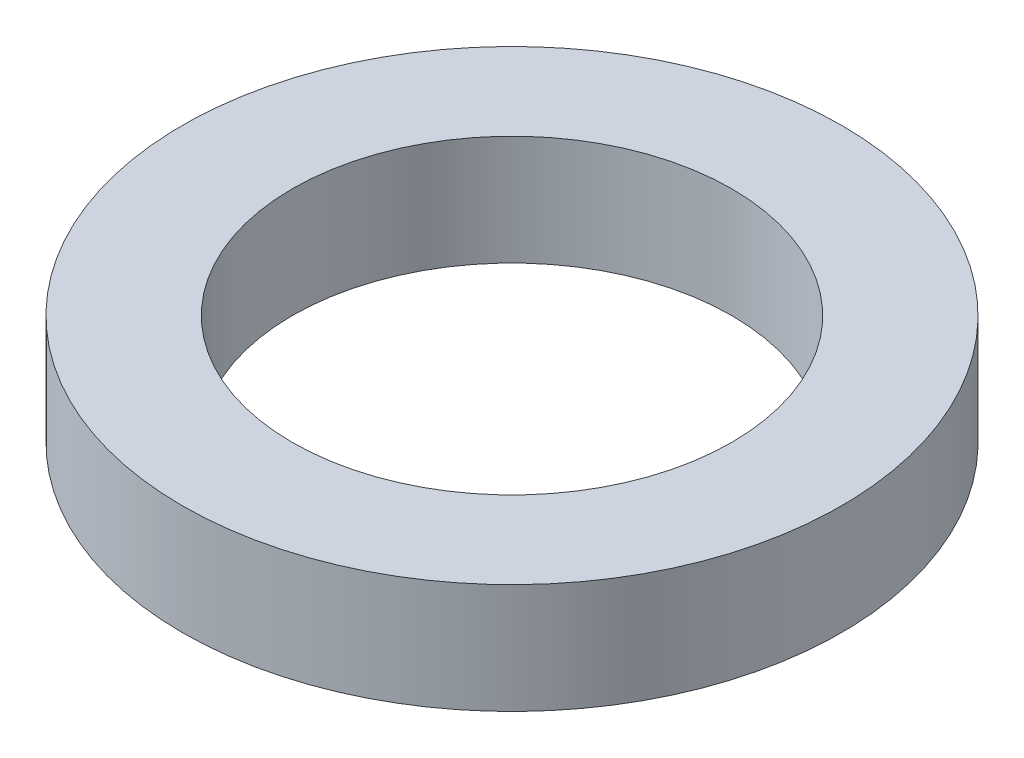
ISO-10303-21;
HEADER;
FILE_DESCRIPTION(('STEP AP214'),'2;1');
FILE_NAME('part.step','',(''),(''),'','','');
FILE_SCHEMA(('AUTOMOTIVE_DESIGN { 1 0 10303 214 1 1 1 1 }'));
ENDSEC;
DATA;
#1=APPLICATION_CONTEXT('core data for automotive mechanical design processes');
#2=APPLICATION_PROTOCOL_DEFINITION('international standard','automotive_design',2000,#1);
#3=PRODUCT_CONTEXT('',#1,'mechanical');
#4=PRODUCT('Part','Part','',(#3));
#5=PRODUCT_RELATED_PRODUCT_CATEGORY('part','',(#4));
#6=PRODUCT_DEFINITION_FORMATION('','',#4);
#7=PRODUCT_DEFINITION_CONTEXT('part definition',#1,'design');
#8=PRODUCT_DEFINITION('design','',#6,#7);
#9=PRODUCT_DEFINITION_SHAPE('','',#8);
#10=(LENGTH_UNIT() NAMED_UNIT(*) SI_UNIT(.MILLI.,.METRE.));
#11=(NAMED_UNIT(*) PLANE_ANGLE_UNIT() SI_UNIT($,.RADIAN.));
#12=(NAMED_UNIT(*) SI_UNIT($,.STERADIAN.) SOLID_ANGLE_UNIT());
#13=UNCERTAINTY_MEASURE_WITH_UNIT(LENGTH_MEASURE(1.E-05),#10,'distance_accuracy_value','');
#14=(GEOMETRIC_REPRESENTATION_CONTEXT(3) GLOBAL_UNCERTAINTY_ASSIGNED_CONTEXT((#13)) GLOBAL_UNIT_ASSIGNED_CONTEXT((#10,
#11,#12)) REPRESENTATION_CONTEXT('',''));
#15=CARTESIAN_POINT('',(0.,0.,0.));
#16=DIRECTION('',(0.,0.,1.));
#17=DIRECTION('',(1.,0.,0.));
#18=AXIS2_PLACEMENT_3D('',#15,#16,#17);
#19=CARTESIAN_POINT('',(0.,2.,0.));
#20=DIRECTION('',(0.,1.,0.));
#21=DIRECTION('',(0.,0.,1.));
#22=AXIS2_PLACEMENT_3D('',#19,#20,#21);
#23=PLANE('',#22);
#24=CARTESIAN_POINT('',(0.,2.,0.));
#25=DIRECTION('',(0.,1.,0.));
#26=DIRECTION('',(0.,0.,1.));
#27=AXIS2_PLACEMENT_3D('',#24,#25,#26);
#28=CIRCLE('',#27,6.);
#29=CARTESIAN_POINT('',(0.,2.,6.));
#30=VERTEX_POINT('',#29);
#31=EDGE_CURVE('E10',#30,#30,#28,.T.);
#32=ORIENTED_EDGE('',*,*,#31,.T.);
#33=EDGE_LOOP('',(#32));
#34=FACE_BOUND('',#33,.T.);
#35=CARTESIAN_POINT('',(0.,2.,0.));
#36=DIRECTION('',(0.,1.,0.));
#37=DIRECTION('',(0.,0.,1.));
#38=AXIS2_PLACEMENT_3D('',#35,#36,#37);
#39=CIRCLE('',#38,4.);
#40=CARTESIAN_POINT('',(0.,2.,4.));
#41=VERTEX_POINT('',#40);
#42=EDGE_CURVE('E48',#41,#41,#39,.T.);
#43=ORIENTED_EDGE('',*,*,#42,.F.);
#44=EDGE_LOOP('',(#43));
#45=FACE_BOUND('',#44,.T.);
#46=ADVANCED_FACE('F37',(#34,#45),#23,.T.);
#47=CARTESIAN_POINT('',(0.,0.,0.));
#48=DIRECTION('',(0.,1.,0.));
#49=DIRECTION('',(0.,0.,1.));
#50=AXIS2_PLACEMENT_3D('',#47,#48,#49);
#51=PLANE('',#50);
#52=CARTESIAN_POINT('',(0.,0.,0.));
#53=DIRECTION('',(0.,1.,0.));
#54=DIRECTION('',(0.,0.,1.));
#55=AXIS2_PLACEMENT_3D('',#52,#53,#54);
#56=CIRCLE('',#55,6.);
#57=CARTESIAN_POINT('',(0.,0.,6.));
#58=VERTEX_POINT('',#57);
#59=EDGE_CURVE('E41',#58,#58,#56,.T.);
#60=ORIENTED_EDGE('',*,*,#59,.F.);
#61=EDGE_LOOP('',(#60));
#62=FACE_BOUND('',#61,.T.);
#63=CARTESIAN_POINT('',(0.,0.,0.));
#64=DIRECTION('',(0.,1.,0.));
#65=DIRECTION('',(0.,0.,1.));
#66=AXIS2_PLACEMENT_3D('',#63,#64,#65);
#67=CIRCLE('',#66,4.);
#68=CARTESIAN_POINT('',(0.,0.,4.));
#69=VERTEX_POINT('',#68);
#70=EDGE_CURVE('E50',#69,#69,#67,.T.);
#71=ORIENTED_EDGE('',*,*,#70,.T.);
#72=EDGE_LOOP('',(#71));
#73=FACE_BOUND('',#72,.T.);
#74=ADVANCED_FACE('F60',(#62,#73),#51,.F.);
#75=CARTESIAN_POINT('',(0.,2.,0.));
#76=DIRECTION('',(0.,-1.,0.));
#77=DIRECTION('',(0.,0.,-1.));
#78=AXIS2_PLACEMENT_3D('',#75,#76,#77);
#79=CYLINDRICAL_SURFACE('',#78,6.);
#80=ORIENTED_EDGE('',*,*,#31,.F.);
#81=EDGE_LOOP('',(#80));
#82=FACE_BOUND('',#81,.T.);
#83=ORIENTED_EDGE('',*,*,#59,.T.);
#84=EDGE_LOOP('',(#83));
#85=FACE_BOUND('',#84,.T.);
#86=ADVANCED_FACE('F39',(#82,#85),#79,.T.);
#87=CARTESIAN_POINT('',(0.,2.,0.));
#88=DIRECTION('',(0.,-1.,0.));
#89=DIRECTION('',(0.,0.,-1.));
#90=AXIS2_PLACEMENT_3D('',#87,#88,#89);
#91=CYLINDRICAL_SURFACE('',#90,4.);
#92=ORIENTED_EDGE('',*,*,#42,.T.);
#93=EDGE_LOOP('',(#92));
#94=FACE_BOUND('',#93,.T.);
#95=ORIENTED_EDGE('',*,*,#70,.F.);
#96=EDGE_LOOP('',(#95));
#97=FACE_BOUND('',#96,.T.);
#98=ADVANCED_FACE('F56',(#94,#97),#91,.F.);
#99=CLOSED_SHELL('',(#46,#74,#86,#98));
#100=MANIFOLD_SOLID_BREP('B2',#99);
#101=ADVANCED_BREP_SHAPE_REPRESENTATION('',(#18,#100),#14);
#102=SHAPE_DEFINITION_REPRESENTATION(#9,#101);
ENDSEC;
END-ISO-10303-21;
